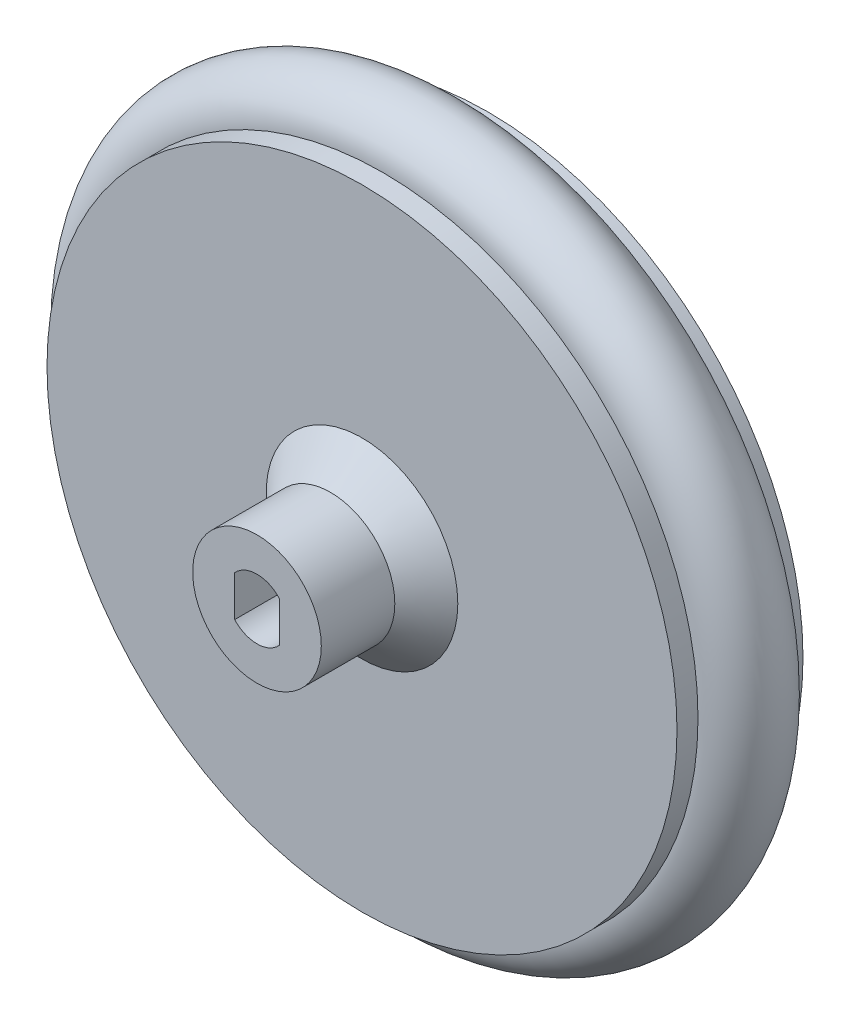
ISO-10303-21;
HEADER;
FILE_DESCRIPTION(('STEP AP214'),'2;1');
FILE_NAME('part.step','',(''),(''),'','','');
FILE_SCHEMA(('AUTOMOTIVE_DESIGN { 1 0 10303 214 1 1 1 1 }'));
ENDSEC;
DATA;
#1=APPLICATION_CONTEXT('core data for automotive mechanical design processes');
#2=APPLICATION_PROTOCOL_DEFINITION('international standard','automotive_design',2000,#1);
#3=PRODUCT_CONTEXT('',#1,'mechanical');
#4=PRODUCT('Part','Part','',(#3));
#5=PRODUCT_RELATED_PRODUCT_CATEGORY('part','',(#4));
#6=PRODUCT_DEFINITION_FORMATION('','',#4);
#7=PRODUCT_DEFINITION_CONTEXT('part definition',#1,'design');
#8=PRODUCT_DEFINITION('design','',#6,#7);
#9=PRODUCT_DEFINITION_SHAPE('','',#8);
#10=(LENGTH_UNIT() NAMED_UNIT(*) SI_UNIT(.MILLI.,.METRE.));
#11=(NAMED_UNIT(*) PLANE_ANGLE_UNIT() SI_UNIT($,.RADIAN.));
#12=(NAMED_UNIT(*) SI_UNIT($,.STERADIAN.) SOLID_ANGLE_UNIT());
#13=UNCERTAINTY_MEASURE_WITH_UNIT(LENGTH_MEASURE(1.E-05),#10,'distance_accuracy_value','');
#14=(GEOMETRIC_REPRESENTATION_CONTEXT(3) GLOBAL_UNCERTAINTY_ASSIGNED_CONTEXT((#13)) GLOBAL_UNIT_ASSIGNED_CONTEXT((#10,
#11,#12)) REPRESENTATION_CONTEXT('',''));
#15=CARTESIAN_POINT('',(0.,0.,0.));
#16=DIRECTION('',(0.,0.,1.));
#17=DIRECTION('',(1.,0.,0.));
#18=AXIS2_PLACEMENT_3D('',#15,#16,#17);
#19=CARTESIAN_POINT('',(0.,0.,12.));
#20=DIRECTION('',(0.,0.,-1.));
#21=DIRECTION('',(-1.,0.,0.));
#22=AXIS2_PLACEMENT_3D('',#19,#20,#21);
#23=CYLINDRICAL_SURFACE('',#22,30.);
#24=CARTESIAN_POINT('',(0.,0.,2.));
#25=DIRECTION('',(0.,0.,1.));
#26=DIRECTION('',(1.,0.,0.));
#27=AXIS2_PLACEMENT_3D('',#24,#25,#26);
#28=CIRCLE('',#27,30.);
#29=CARTESIAN_POINT('',(30.,0.,2.));
#30=VERTEX_POINT('',#29);
#31=EDGE_CURVE('E198',#30,#30,#28,.T.);
#32=ORIENTED_EDGE('',*,*,#31,.F.);
#33=EDGE_LOOP('',(#32));
#34=FACE_BOUND('',#33,.T.);
#35=CARTESIAN_POINT('',(0.,0.,0.));
#36=DIRECTION('',(0.,0.,1.));
#37=DIRECTION('',(1.,0.,0.));
#38=AXIS2_PLACEMENT_3D('',#35,#36,#37);
#39=CIRCLE('',#38,30.);
#40=CARTESIAN_POINT('',(30.,0.,0.));
#41=VERTEX_POINT('',#40);
#42=EDGE_CURVE('E140',#41,#41,#39,.T.);
#43=ORIENTED_EDGE('',*,*,#42,.T.);
#44=EDGE_LOOP('',(#43));
#45=FACE_BOUND('',#44,.T.);
#46=ADVANCED_FACE('F43',(#34,#45),#23,.T.);
#47=CARTESIAN_POINT('',(0.,0.,0.));
#48=DIRECTION('',(0.,0.,1.));
#49=DIRECTION('',(1.,0.,0.));
#50=AXIS2_PLACEMENT_3D('',#47,#48,#49);
#51=PLANE('',#50);
#52=CARTESIAN_POINT('',(0.,0.,0.));
#53=DIRECTION('',(0.,0.,1.));
#54=DIRECTION('',(1.,0.,0.));
#55=AXIS2_PLACEMENT_3D('',#52,#53,#54);
#56=CIRCLE('',#55,1.25);
#57=CARTESIAN_POINT('',(1.25,0.,0.));
#58=VERTEX_POINT('',#57);
#59=EDGE_CURVE('E121',#58,#58,#56,.T.);
#60=ORIENTED_EDGE('',*,*,#59,.T.);
#61=EDGE_LOOP('',(#60));
#62=FACE_BOUND('',#61,.T.);
#63=ORIENTED_EDGE('',*,*,#42,.F.);
#64=EDGE_LOOP('',(#63));
#65=FACE_BOUND('',#64,.T.);
#66=ADVANCED_FACE('F169',(#62,#65),#51,.F.);
#67=CARTESIAN_POINT('',(0.,0.,12.));
#68=DIRECTION('',(0.,0.,1.));
#69=DIRECTION('',(1.,0.,0.));
#70=AXIS2_PLACEMENT_3D('',#67,#68,#69);
#71=PLANE('',#70);
#72=CARTESIAN_POINT('',(0.,0.,12.));
#73=DIRECTION('',(0.,0.,1.));
#74=DIRECTION('',(1.,0.,0.));
#75=AXIS2_PLACEMENT_3D('',#72,#73,#74);
#76=CIRCLE('',#75,9.12499999999999);
#77=CARTESIAN_POINT('',(9.12499999999999,0.,12.));
#78=VERTEX_POINT('',#77);
#79=EDGE_CURVE('E11',#78,#78,#76,.F.);
#80=ORIENTED_EDGE('',*,*,#79,.T.);
#81=EDGE_LOOP('',(#80));
#82=FACE_BOUND('',#81,.T.);
#83=CARTESIAN_POINT('',(0.,0.,12.));
#84=DIRECTION('',(0.,0.,1.));
#85=DIRECTION('',(1.,0.,0.));
#86=AXIS2_PLACEMENT_3D('',#83,#84,#85);
#87=CIRCLE('',#86,30.);
#88=CARTESIAN_POINT('',(30.,0.,12.));
#89=VERTEX_POINT('',#88);
#90=EDGE_CURVE('E141',#89,#89,#87,.T.);
#91=ORIENTED_EDGE('',*,*,#90,.T.);
#92=EDGE_LOOP('',(#91));
#93=FACE_BOUND('',#92,.T.);
#94=ADVANCED_FACE('F175',(#82,#93),#71,.T.);
#95=CARTESIAN_POINT('',(0.,0.,10.));
#96=DIRECTION('',(0.,0.,-1.));
#97=DIRECTION('',(-1.,0.,0.));
#98=AXIS2_PLACEMENT_3D('',#95,#96,#97);
#99=CIRCLE('',#98,30.);
#100=CARTESIAN_POINT('',(-30.,0.,10.));
#101=VERTEX_POINT('',#100);
#102=EDGE_CURVE('E193',#101,#101,#99,.T.);
#103=ORIENTED_EDGE('',*,*,#102,.F.);
#104=EDGE_LOOP('',(#103));
#105=FACE_BOUND('',#104,.T.);
#106=ORIENTED_EDGE('',*,*,#90,.F.);
#107=EDGE_LOOP('',(#106));
#108=FACE_BOUND('',#107,.T.);
#109=ADVANCED_FACE('F171',(#105,#108),#23,.T.);
#110=CARTESIAN_POINT('',(0.,0.,22.));
#111=DIRECTION('',(0.,0.,1.));
#112=DIRECTION('',(1.,0.,0.));
#113=AXIS2_PLACEMENT_3D('',#110,#111,#112);
#114=PLANE('',#113);
#115=CARTESIAN_POINT('',(0.,0.,22.));
#116=DIRECTION('',(0.,0.,1.));
#117=DIRECTION('',(1.,0.,0.));
#118=AXIS2_PLACEMENT_3D('',#115,#116,#117);
#119=CIRCLE('',#118,6.125);
#120=CARTESIAN_POINT('',(6.125,0.,22.));
#121=VERTEX_POINT('',#120);
#122=EDGE_CURVE('E103',#121,#121,#119,.T.);
#123=ORIENTED_EDGE('',*,*,#122,.T.);
#124=EDGE_LOOP('',(#123));
#125=FACE_BOUND('',#124,.T.);
#126=DIRECTION('',(0.,-1.,0.));
#127=VECTOR('',#126,1.);
#128=CARTESIAN_POINT('',(-2.125,1.93649167310371,22.));
#129=LINE('',#128,#127);
#130=CARTESIAN_POINT('',(-2.125,1.93649167310371,22.));
#131=VERTEX_POINT('',#130);
#132=CARTESIAN_POINT('',(-2.125,-1.93649167310371,22.));
#133=VERTEX_POINT('',#132);
#134=EDGE_CURVE('E94',#131,#133,#129,.T.);
#135=ORIENTED_EDGE('',*,*,#134,.F.);
#136=CARTESIAN_POINT('',(0.,0.,22.));
#137=DIRECTION('',(0.,0.,1.));
#138=DIRECTION('',(1.,0.,0.));
#139=AXIS2_PLACEMENT_3D('',#136,#137,#138);
#140=CIRCLE('',#139,2.875);
#141=CARTESIAN_POINT('',(2.125,1.93649167310371,22.));
#142=VERTEX_POINT('',#141);
#143=EDGE_CURVE('E85',#142,#131,#140,.T.);
#144=ORIENTED_EDGE('',*,*,#143,.F.);
#145=DIRECTION('',(0.,1.,0.));
#146=VECTOR('',#145,1.);
#147=CARTESIAN_POINT('',(2.125,1.93649167310371,22.));
#148=LINE('',#147,#146);
#149=CARTESIAN_POINT('',(2.125,-1.93649167310371,22.));
#150=VERTEX_POINT('',#149);
#151=EDGE_CURVE('E112',#150,#142,#148,.T.);
#152=ORIENTED_EDGE('',*,*,#151,.F.);
#153=CARTESIAN_POINT('',(0.,0.,22.));
#154=DIRECTION('',(0.,0.,1.));
#155=DIRECTION('',(1.,0.,0.));
#156=AXIS2_PLACEMENT_3D('',#153,#154,#155);
#157=CIRCLE('',#156,2.875);
#158=EDGE_CURVE('E108',#133,#150,#157,.T.);
#159=ORIENTED_EDGE('',*,*,#158,.F.);
#160=EDGE_LOOP('',(#135,#144,#152,#159));
#161=FACE_BOUND('',#160,.T.);
#162=ADVANCED_FACE('F107',(#125,#161),#114,.T.);
#163=CARTESIAN_POINT('',(0.,0.,22.));
#164=DIRECTION('',(0.,0.,-1.));
#165=DIRECTION('',(-1.,0.,0.));
#166=AXIS2_PLACEMENT_3D('',#163,#164,#165);
#167=CYLINDRICAL_SURFACE('',#166,6.125);
#168=CARTESIAN_POINT('',(0.,0.,15.));
#169=DIRECTION('',(0.,0.,1.));
#170=DIRECTION('',(1.,0.,0.));
#171=AXIS2_PLACEMENT_3D('',#168,#169,#170);
#172=CIRCLE('',#171,6.125);
#173=CARTESIAN_POINT('',(6.125,0.,15.));
#174=VERTEX_POINT('',#173);
#175=EDGE_CURVE('E53',#174,#174,#172,.T.);
#176=ORIENTED_EDGE('',*,*,#175,.T.);
#177=EDGE_LOOP('',(#176));
#178=FACE_BOUND('',#177,.T.);
#179=ORIENTED_EDGE('',*,*,#122,.F.);
#180=EDGE_LOOP('',(#179));
#181=FACE_BOUND('',#180,.T.);
#182=ADVANCED_FACE('F151',(#178,#181),#167,.T.);
#183=CARTESIAN_POINT('',(0.,0.,22.));
#184=DIRECTION('',(0.,0.,-1.));
#185=DIRECTION('',(-1.,0.,0.));
#186=AXIS2_PLACEMENT_3D('',#183,#184,#185);
#187=CYLINDRICAL_SURFACE('',#186,2.875);
#188=CARTESIAN_POINT('',(0.,0.,12.));
#189=DIRECTION('',(0.,0.,1.));
#190=DIRECTION('',(1.,0.,0.));
#191=AXIS2_PLACEMENT_3D('',#188,#189,#190);
#192=CIRCLE('',#191,2.875);
#193=CARTESIAN_POINT('',(2.125,1.93649167310371,12.));
#194=VERTEX_POINT('',#193);
#195=CARTESIAN_POINT('',(-2.125,1.93649167310371,12.));
#196=VERTEX_POINT('',#195);
#197=EDGE_CURVE('E118',#194,#196,#192,.T.);
#198=ORIENTED_EDGE('',*,*,#197,.F.);
#199=DIRECTION('',(0.,0.,-1.));
#200=VECTOR('',#199,1.);
#201=CARTESIAN_POINT('',(2.125,1.93649167310371,22.));
#202=LINE('',#201,#200);
#203=EDGE_CURVE('E60',#142,#194,#202,.T.);
#204=ORIENTED_EDGE('',*,*,#203,.F.);
#205=ORIENTED_EDGE('',*,*,#143,.T.);
#206=DIRECTION('',(0.,0.,-1.));
#207=VECTOR('',#206,1.);
#208=CARTESIAN_POINT('',(-2.125,1.93649167310371,22.));
#209=LINE('',#208,#207);
#210=EDGE_CURVE('E88',#131,#196,#209,.T.);
#211=ORIENTED_EDGE('',*,*,#210,.T.);
#212=EDGE_LOOP('',(#198,#204,#205,#211));
#213=FACE_BOUND('',#212,.T.);
#214=ADVANCED_FACE('F87',(#213),#187,.F.);
#215=CARTESIAN_POINT('',(-2.125,1.93649167310371,22.));
#216=DIRECTION('',(1.,0.,0.));
#217=DIRECTION('',(0.,0.,-1.));
#218=AXIS2_PLACEMENT_3D('',#215,#216,#217);
#219=PLANE('',#218);
#220=DIRECTION('',(0.,-1.,0.));
#221=VECTOR('',#220,1.);
#222=CARTESIAN_POINT('',(-2.125,1.93649167310371,12.));
#223=LINE('',#222,#221);
#224=CARTESIAN_POINT('',(-2.125,-1.93649167310371,12.));
#225=VERTEX_POINT('',#224);
#226=EDGE_CURVE('E101',#196,#225,#223,.T.);
#227=ORIENTED_EDGE('',*,*,#226,.F.);
#228=ORIENTED_EDGE('',*,*,#210,.F.);
#229=ORIENTED_EDGE('',*,*,#134,.T.);
#230=DIRECTION('',(0.,0.,-1.));
#231=VECTOR('',#230,1.);
#232=CARTESIAN_POINT('',(-2.125,-1.93649167310371,22.));
#233=LINE('',#232,#231);
#234=EDGE_CURVE('E104',#133,#225,#233,.T.);
#235=ORIENTED_EDGE('',*,*,#234,.T.);
#236=EDGE_LOOP('',(#227,#228,#229,#235));
#237=FACE_BOUND('',#236,.T.);
#238=ADVANCED_FACE('F98',(#237),#219,.T.);
#239=CARTESIAN_POINT('',(0.,0.,22.));
#240=DIRECTION('',(0.,0.,-1.));
#241=DIRECTION('',(-1.,0.,0.));
#242=AXIS2_PLACEMENT_3D('',#239,#240,#241);
#243=CYLINDRICAL_SURFACE('',#242,2.875);
#244=CARTESIAN_POINT('',(0.,0.,12.));
#245=DIRECTION('',(0.,0.,1.));
#246=DIRECTION('',(1.,0.,0.));
#247=AXIS2_PLACEMENT_3D('',#244,#245,#246);
#248=CIRCLE('',#247,2.875);
#249=CARTESIAN_POINT('',(2.125,-1.93649167310371,12.));
#250=VERTEX_POINT('',#249);
#251=EDGE_CURVE('E124',#225,#250,#248,.T.);
#252=ORIENTED_EDGE('',*,*,#251,.F.);
#253=ORIENTED_EDGE('',*,*,#234,.F.);
#254=ORIENTED_EDGE('',*,*,#158,.T.);
#255=DIRECTION('',(0.,0.,-1.));
#256=VECTOR('',#255,1.);
#257=CARTESIAN_POINT('',(2.125,-1.93649167310371,22.));
#258=LINE('',#257,#256);
#259=EDGE_CURVE('E65',#150,#250,#258,.T.);
#260=ORIENTED_EDGE('',*,*,#259,.T.);
#261=EDGE_LOOP('',(#252,#253,#254,#260));
#262=FACE_BOUND('',#261,.T.);
#263=ADVANCED_FACE('F217',(#262),#243,.F.);
#264=CARTESIAN_POINT('',(2.125,1.93649167310371,22.));
#265=DIRECTION('',(-1.,0.,0.));
#266=DIRECTION('',(0.,0.,1.));
#267=AXIS2_PLACEMENT_3D('',#264,#265,#266);
#268=PLANE('',#267);
#269=DIRECTION('',(0.,1.,0.));
#270=VECTOR('',#269,1.);
#271=CARTESIAN_POINT('',(2.125,1.93649167310371,12.));
#272=LINE('',#271,#270);
#273=EDGE_CURVE('E95',#250,#194,#272,.T.);
#274=ORIENTED_EDGE('',*,*,#273,.F.);
#275=ORIENTED_EDGE('',*,*,#259,.F.);
#276=ORIENTED_EDGE('',*,*,#151,.T.);
#277=ORIENTED_EDGE('',*,*,#203,.T.);
#278=EDGE_LOOP('',(#274,#275,#276,#277));
#279=FACE_BOUND('',#278,.T.);
#280=ADVANCED_FACE('F214',(#279),#268,.T.);
#281=CARTESIAN_POINT('',(0.,0.,12.));
#282=DIRECTION('',(0.,0.,1.));
#283=DIRECTION('',(1.,0.,0.));
#284=AXIS2_PLACEMENT_3D('',#281,#282,#283);
#285=CIRCLE('',#284,1.25);
#286=CARTESIAN_POINT('',(1.25,0.,12.));
#287=VERTEX_POINT('',#286);
#288=EDGE_CURVE('E202',#287,#287,#285,.T.);
#289=ORIENTED_EDGE('',*,*,#288,.F.);
#290=EDGE_LOOP('',(#289));
#291=FACE_BOUND('',#290,.T.);
#292=ORIENTED_EDGE('',*,*,#273,.T.);
#293=ORIENTED_EDGE('',*,*,#197,.T.);
#294=ORIENTED_EDGE('',*,*,#226,.T.);
#295=ORIENTED_EDGE('',*,*,#251,.T.);
#296=EDGE_LOOP('',(#292,#293,#294,#295));
#297=FACE_BOUND('',#296,.T.);
#298=ADVANCED_FACE('F164',(#291,#297),#71,.T.);
#299=CARTESIAN_POINT('',(0.,0.,0.));
#300=DIRECTION('',(0.,0.,1.));
#301=DIRECTION('',(1.,0.,0.));
#302=AXIS2_PLACEMENT_3D('',#299,#300,#301);
#303=CYLINDRICAL_SURFACE('',#302,1.25);
#304=ORIENTED_EDGE('',*,*,#59,.F.);
#305=EDGE_LOOP('',(#304));
#306=FACE_BOUND('',#305,.T.);
#307=ORIENTED_EDGE('',*,*,#288,.T.);
#308=EDGE_LOOP('',(#307));
#309=FACE_BOUND('',#308,.T.);
#310=ADVANCED_FACE('F156',(#306,#309),#303,.F.);
#311=CARTESIAN_POINT('',(0.,0.,15.));
#312=DIRECTION('',(0.,0.,-1.));
#313=DIRECTION('',(-1.,0.,0.));
#314=AXIS2_PLACEMENT_3D('',#311,#312,#313);
#315=CONICAL_SURFACE('',#314,6.125,0.785398163397444);
#316=ORIENTED_EDGE('',*,*,#79,.F.);
#317=EDGE_LOOP('',(#316));
#318=FACE_BOUND('',#317,.T.);
#319=ORIENTED_EDGE('',*,*,#175,.F.);
#320=EDGE_LOOP('',(#319));
#321=FACE_BOUND('',#320,.T.);
#322=ADVANCED_FACE('F46',(#318,#321),#315,.T.);
#323=CARTESIAN_POINT('',(0.,0.,6.));
#324=DIRECTION('',(0.,0.,1.));
#325=DIRECTION('',(1.,0.,0.));
#326=AXIS2_PLACEMENT_3D('',#323,#324,#325);
#327=TOROIDAL_SURFACE('',#326,30.,4.);
#328=ORIENTED_EDGE('',*,*,#31,.T.);
#329=EDGE_LOOP('',(#328));
#330=FACE_BOUND('',#329,.T.);
#331=ORIENTED_EDGE('',*,*,#102,.T.);
#332=EDGE_LOOP('',(#331));
#333=FACE_BOUND('',#332,.T.);
#334=ADVANCED_FACE('F155',(#330,#333),#327,.T.);
#335=CLOSED_SHELL('',(#46,#66,#94,#109,#162,#182,#214,#238,#263,#280,#298,#310,#322,#334));
#336=MANIFOLD_SOLID_BREP('B2',#335);
#337=ADVANCED_BREP_SHAPE_REPRESENTATION('',(#18,#336),#14);
#338=SHAPE_DEFINITION_REPRESENTATION(#9,#337);
ENDSEC;
END-ISO-10303-21;
